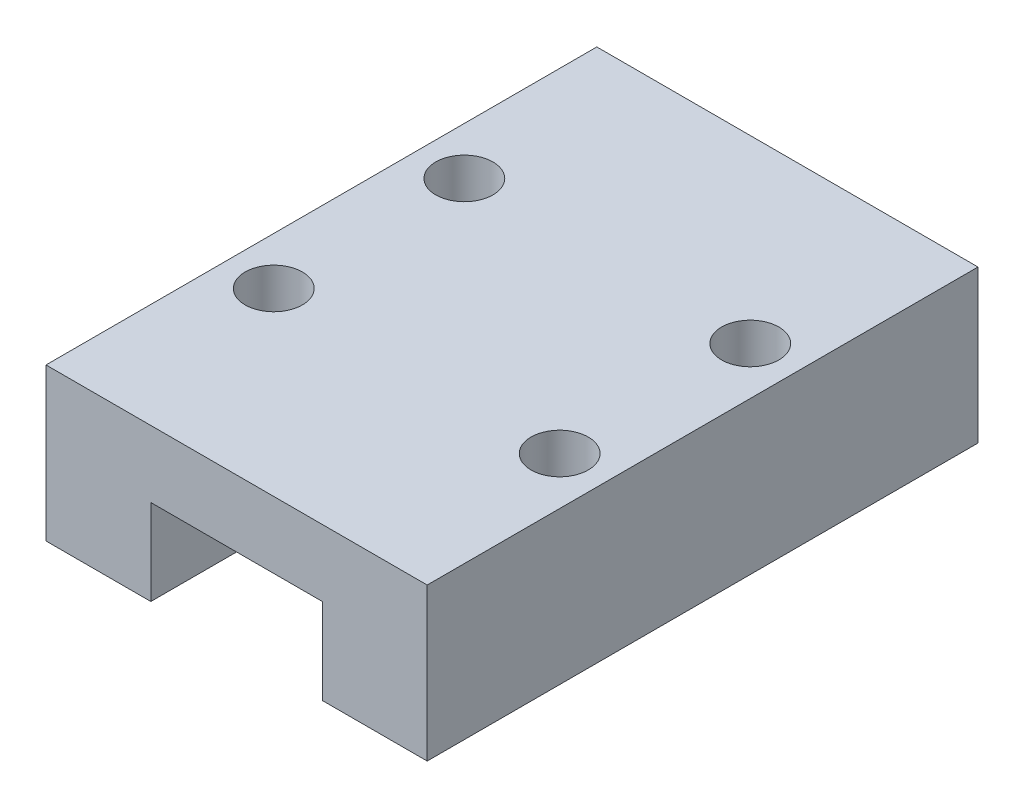
ISO-10303-21;
HEADER;
FILE_DESCRIPTION(('STEP AP214'),'2;1');
FILE_NAME('part.step','',(''),(''),'','','');
FILE_SCHEMA(('AUTOMOTIVE_DESIGN { 1 0 10303 214 1 1 1 1 }'));
ENDSEC;
DATA;
#1=APPLICATION_CONTEXT('core data for automotive mechanical design processes');
#2=APPLICATION_PROTOCOL_DEFINITION('international standard','automotive_design',2000,#1);
#3=PRODUCT_CONTEXT('',#1,'mechanical');
#4=PRODUCT('Part','Part','',(#3));
#5=PRODUCT_RELATED_PRODUCT_CATEGORY('part','',(#4));
#6=PRODUCT_DEFINITION_FORMATION('','',#4);
#7=PRODUCT_DEFINITION_CONTEXT('part definition',#1,'design');
#8=PRODUCT_DEFINITION('design','',#6,#7);
#9=PRODUCT_DEFINITION_SHAPE('','',#8);
#10=(LENGTH_UNIT() NAMED_UNIT(*) SI_UNIT(.MILLI.,.METRE.));
#11=(NAMED_UNIT(*) PLANE_ANGLE_UNIT() SI_UNIT($,.RADIAN.));
#12=(NAMED_UNIT(*) SI_UNIT($,.STERADIAN.) SOLID_ANGLE_UNIT());
#13=UNCERTAINTY_MEASURE_WITH_UNIT(LENGTH_MEASURE(1.E-05),#10,'distance_accuracy_value','');
#14=(GEOMETRIC_REPRESENTATION_CONTEXT(3) GLOBAL_UNCERTAINTY_ASSIGNED_CONTEXT((#13)) GLOBAL_UNIT_ASSIGNED_CONTEXT((#10,
#11,#12)) REPRESENTATION_CONTEXT('',''));
#15=CARTESIAN_POINT('',(0.,0.,0.));
#16=DIRECTION('',(0.,0.,1.));
#17=DIRECTION('',(1.,0.,0.));
#18=AXIS2_PLACEMENT_3D('',#15,#16,#17);
#19=CARTESIAN_POINT('',(0.,0.500000000000002,28.9));
#20=DIRECTION('',(0.,1.,0.));
#21=DIRECTION('',(0.,0.,1.));
#22=AXIS2_PLACEMENT_3D('',#19,#20,#21);
#23=PLANE('',#22);
#24=DIRECTION('',(1.,0.,0.));
#25=VECTOR('',#24,1.);
#26=CARTESIAN_POINT('',(0.,0.500000000000002,0.));
#27=LINE('',#26,#25);
#28=CARTESIAN_POINT('',(-4.5,0.500000000000002,0.));
#29=VERTEX_POINT('',#28);
#30=CARTESIAN_POINT('',(4.5,0.500000000000002,0.));
#31=VERTEX_POINT('',#30);
#32=EDGE_CURVE('E153',#29,#31,#27,.T.);
#33=ORIENTED_EDGE('',*,*,#32,.T.);
#34=DIRECTION('',(0.,0.,-1.));
#35=VECTOR('',#34,1.);
#36=CARTESIAN_POINT('',(4.5,0.500000000000002,28.9));
#37=LINE('',#36,#35);
#38=CARTESIAN_POINT('',(4.5,0.500000000000002,28.9));
#39=VERTEX_POINT('',#38);
#40=EDGE_CURVE('E11',#39,#31,#37,.T.);
#41=ORIENTED_EDGE('',*,*,#40,.F.);
#42=DIRECTION('',(1.,0.,0.));
#43=VECTOR('',#42,1.);
#44=CARTESIAN_POINT('',(0.,0.500000000000002,28.9));
#45=LINE('',#44,#43);
#46=CARTESIAN_POINT('',(-4.5,0.500000000000002,28.9));
#47=VERTEX_POINT('',#46);
#48=EDGE_CURVE('E142',#47,#39,#45,.T.);
#49=ORIENTED_EDGE('',*,*,#48,.F.);
#50=DIRECTION('',(0.,0.,-1.));
#51=VECTOR('',#50,1.);
#52=CARTESIAN_POINT('',(-4.5,0.500000000000002,28.9));
#53=LINE('',#52,#51);
#54=EDGE_CURVE('E57',#47,#29,#53,.T.);
#55=ORIENTED_EDGE('',*,*,#54,.T.);
#56=EDGE_LOOP('',(#33,#41,#49,#55));
#57=FACE_BOUND('',#56,.T.);
#58=ADVANCED_FACE('F41',(#57),#23,.F.);
#59=CARTESIAN_POINT('',(4.5,0.,28.9));
#60=DIRECTION('',(1.,0.,0.));
#61=DIRECTION('',(0.,1.,0.));
#62=AXIS2_PLACEMENT_3D('',#59,#60,#61);
#63=PLANE('',#62);
#64=DIRECTION('',(0.,-1.,0.));
#65=VECTOR('',#64,1.);
#66=CARTESIAN_POINT('',(4.5,0.,0.));
#67=LINE('',#66,#65);
#68=CARTESIAN_POINT('',(4.5,-4.,0.));
#69=VERTEX_POINT('',#68);
#70=EDGE_CURVE('E210',#31,#69,#67,.T.);
#71=ORIENTED_EDGE('',*,*,#70,.T.);
#72=DIRECTION('',(0.,0.,-1.));
#73=VECTOR('',#72,1.);
#74=CARTESIAN_POINT('',(4.5,-4.,28.9));
#75=LINE('',#74,#73);
#76=CARTESIAN_POINT('',(4.5,-4.,28.9));
#77=VERTEX_POINT('',#76);
#78=EDGE_CURVE('E49',#77,#69,#75,.T.);
#79=ORIENTED_EDGE('',*,*,#78,.F.);
#80=DIRECTION('',(0.,-1.,0.));
#81=VECTOR('',#80,1.);
#82=CARTESIAN_POINT('',(4.5,0.,28.9));
#83=LINE('',#82,#81);
#84=EDGE_CURVE('E95',#39,#77,#83,.T.);
#85=ORIENTED_EDGE('',*,*,#84,.F.);
#86=ORIENTED_EDGE('',*,*,#40,.T.);
#87=EDGE_LOOP('',(#71,#79,#85,#86));
#88=FACE_BOUND('',#87,.T.);
#89=ADVANCED_FACE('F211',(#88),#63,.F.);
#90=CARTESIAN_POINT('',(0.,-4.,28.9));
#91=DIRECTION('',(0.,-1.,0.));
#92=DIRECTION('',(1.,0.,0.));
#93=AXIS2_PLACEMENT_3D('',#90,#91,#92);
#94=PLANE('',#93);
#95=DIRECTION('',(-1.,0.,0.));
#96=VECTOR('',#95,1.);
#97=CARTESIAN_POINT('',(0.,-4.,0.));
#98=LINE('',#97,#96);
#99=CARTESIAN_POINT('',(10.,-4.,0.));
#100=VERTEX_POINT('',#99);
#101=EDGE_CURVE('E197',#100,#69,#98,.T.);
#102=ORIENTED_EDGE('',*,*,#101,.F.);
#103=DIRECTION('',(0.,0.,-1.));
#104=VECTOR('',#103,1.);
#105=CARTESIAN_POINT('',(10.,-4.,28.9));
#106=LINE('',#105,#104);
#107=CARTESIAN_POINT('',(10.,-4.,28.9));
#108=VERTEX_POINT('',#107);
#109=EDGE_CURVE('E205',#108,#100,#106,.T.);
#110=ORIENTED_EDGE('',*,*,#109,.F.);
#111=DIRECTION('',(-1.,0.,0.));
#112=VECTOR('',#111,1.);
#113=CARTESIAN_POINT('',(0.,-4.,28.9));
#114=LINE('',#113,#112);
#115=EDGE_CURVE('E134',#108,#77,#114,.T.);
#116=ORIENTED_EDGE('',*,*,#115,.T.);
#117=ORIENTED_EDGE('',*,*,#78,.T.);
#118=EDGE_LOOP('',(#102,#110,#116,#117));
#119=FACE_BOUND('',#118,.T.);
#120=ADVANCED_FACE('F208',(#119),#94,.T.);
#121=CARTESIAN_POINT('',(10.,0.,28.9));
#122=DIRECTION('',(-1.,0.,0.));
#123=DIRECTION('',(0.,0.,1.));
#124=AXIS2_PLACEMENT_3D('',#121,#122,#123);
#125=PLANE('',#124);
#126=DIRECTION('',(0.,1.,0.));
#127=VECTOR('',#126,1.);
#128=CARTESIAN_POINT('',(10.,0.,0.));
#129=LINE('',#128,#127);
#130=CARTESIAN_POINT('',(10.,4.,0.));
#131=VERTEX_POINT('',#130);
#132=EDGE_CURVE('E190',#100,#131,#129,.T.);
#133=ORIENTED_EDGE('',*,*,#132,.T.);
#134=DIRECTION('',(0.,0.,-1.));
#135=VECTOR('',#134,1.);
#136=CARTESIAN_POINT('',(10.,4.,28.9));
#137=LINE('',#136,#135);
#138=CARTESIAN_POINT('',(10.,4.,28.9));
#139=VERTEX_POINT('',#138);
#140=EDGE_CURVE('E187',#139,#131,#137,.T.);
#141=ORIENTED_EDGE('',*,*,#140,.F.);
#142=DIRECTION('',(0.,1.,0.));
#143=VECTOR('',#142,1.);
#144=CARTESIAN_POINT('',(10.,0.,28.9));
#145=LINE('',#144,#143);
#146=EDGE_CURVE('E139',#108,#139,#145,.T.);
#147=ORIENTED_EDGE('',*,*,#146,.F.);
#148=ORIENTED_EDGE('',*,*,#109,.T.);
#149=EDGE_LOOP('',(#133,#141,#147,#148));
#150=FACE_BOUND('',#149,.T.);
#151=ADVANCED_FACE('F177',(#150),#125,.F.);
#152=CARTESIAN_POINT('',(0.,4.,28.9));
#153=DIRECTION('',(0.,-1.,0.));
#154=DIRECTION('',(1.,0.,0.));
#155=AXIS2_PLACEMENT_3D('',#152,#153,#154);
#156=PLANE('',#155);
#157=CARTESIAN_POINT('',(-7.5,4.,19.45));
#158=DIRECTION('',(0.,1.,0.));
#159=DIRECTION('',(-1.,0.,0.));
#160=AXIS2_PLACEMENT_3D('',#157,#158,#159);
#161=CIRCLE('',#160,1.5);
#162=CARTESIAN_POINT('',(-9.,4.,19.45));
#163=VERTEX_POINT('',#162);
#164=EDGE_CURVE('E157',#163,#163,#161,.T.);
#165=ORIENTED_EDGE('',*,*,#164,.F.);
#166=EDGE_LOOP('',(#165));
#167=FACE_BOUND('',#166,.T.);
#168=CARTESIAN_POINT('',(7.5,4.,9.45));
#169=DIRECTION('',(0.,1.,0.));
#170=DIRECTION('',(-1.,0.,0.));
#171=AXIS2_PLACEMENT_3D('',#168,#169,#170);
#172=CIRCLE('',#171,1.5);
#173=CARTESIAN_POINT('',(6.,4.,9.45));
#174=VERTEX_POINT('',#173);
#175=EDGE_CURVE('E163',#174,#174,#172,.T.);
#176=ORIENTED_EDGE('',*,*,#175,.F.);
#177=EDGE_LOOP('',(#176));
#178=FACE_BOUND('',#177,.T.);
#179=CARTESIAN_POINT('',(7.5,4.,19.45));
#180=DIRECTION('',(0.,1.,0.));
#181=DIRECTION('',(-1.,0.,0.));
#182=AXIS2_PLACEMENT_3D('',#179,#180,#181);
#183=CIRCLE('',#182,1.5);
#184=CARTESIAN_POINT('',(6.,4.,19.45));
#185=VERTEX_POINT('',#184);
#186=EDGE_CURVE('E150',#185,#185,#183,.T.);
#187=ORIENTED_EDGE('',*,*,#186,.F.);
#188=EDGE_LOOP('',(#187));
#189=FACE_BOUND('',#188,.T.);
#190=CARTESIAN_POINT('',(-7.5,4.,9.45));
#191=DIRECTION('',(0.,1.,0.));
#192=DIRECTION('',(-1.,0.,0.));
#193=AXIS2_PLACEMENT_3D('',#190,#191,#192);
#194=CIRCLE('',#193,1.5);
#195=CARTESIAN_POINT('',(-9.,4.,9.45));
#196=VERTEX_POINT('',#195);
#197=EDGE_CURVE('E146',#196,#196,#194,.T.);
#198=ORIENTED_EDGE('',*,*,#197,.F.);
#199=EDGE_LOOP('',(#198));
#200=FACE_BOUND('',#199,.T.);
#201=DIRECTION('',(-1.,0.,0.));
#202=VECTOR('',#201,1.);
#203=CARTESIAN_POINT('',(0.,4.,0.));
#204=LINE('',#203,#202);
#205=CARTESIAN_POINT('',(-9.99999999999999,4.,0.));
#206=VERTEX_POINT('',#205);
#207=EDGE_CURVE('E185',#131,#206,#204,.T.);
#208=ORIENTED_EDGE('',*,*,#207,.T.);
#209=DIRECTION('',(0.,0.,-1.));
#210=VECTOR('',#209,1.);
#211=CARTESIAN_POINT('',(-9.99999999999999,4.,28.9));
#212=LINE('',#211,#210);
#213=CARTESIAN_POINT('',(-9.99999999999999,4.,28.9));
#214=VERTEX_POINT('',#213);
#215=EDGE_CURVE('E120',#214,#206,#212,.T.);
#216=ORIENTED_EDGE('',*,*,#215,.F.);
#217=DIRECTION('',(-1.,0.,0.));
#218=VECTOR('',#217,1.);
#219=CARTESIAN_POINT('',(0.,4.,28.9));
#220=LINE('',#219,#218);
#221=EDGE_CURVE('E128',#139,#214,#220,.T.);
#222=ORIENTED_EDGE('',*,*,#221,.F.);
#223=ORIENTED_EDGE('',*,*,#140,.T.);
#224=EDGE_LOOP('',(#208,#216,#222,#223));
#225=FACE_BOUND('',#224,.T.);
#226=ADVANCED_FACE('F174',(#167,#178,#189,#200,#225),#156,.F.);
#227=CARTESIAN_POINT('',(-9.99999999999999,0.,28.9));
#228=DIRECTION('',(-1.,0.,0.));
#229=DIRECTION('',(0.,-1.,0.));
#230=AXIS2_PLACEMENT_3D('',#227,#228,#229);
#231=PLANE('',#230);
#232=DIRECTION('',(0.,1.,0.));
#233=VECTOR('',#232,1.);
#234=CARTESIAN_POINT('',(-9.99999999999999,0.,0.));
#235=LINE('',#234,#233);
#236=CARTESIAN_POINT('',(-9.99999999999999,-4.,0.));
#237=VERTEX_POINT('',#236);
#238=EDGE_CURVE('E116',#237,#206,#235,.T.);
#239=ORIENTED_EDGE('',*,*,#238,.F.);
#240=DIRECTION('',(0.,0.,-1.));
#241=VECTOR('',#240,1.);
#242=CARTESIAN_POINT('',(-9.99999999999999,-4.,28.9));
#243=LINE('',#242,#241);
#244=CARTESIAN_POINT('',(-9.99999999999999,-4.,28.9));
#245=VERTEX_POINT('',#244);
#246=EDGE_CURVE('E111',#245,#237,#243,.T.);
#247=ORIENTED_EDGE('',*,*,#246,.F.);
#248=DIRECTION('',(0.,1.,0.));
#249=VECTOR('',#248,1.);
#250=CARTESIAN_POINT('',(-9.99999999999999,0.,28.9));
#251=LINE('',#250,#249);
#252=EDGE_CURVE('E114',#245,#214,#251,.T.);
#253=ORIENTED_EDGE('',*,*,#252,.T.);
#254=ORIENTED_EDGE('',*,*,#215,.T.);
#255=EDGE_LOOP('',(#239,#247,#253,#254));
#256=FACE_BOUND('',#255,.T.);
#257=ADVANCED_FACE('F113',(#256),#231,.T.);
#258=CARTESIAN_POINT('',(-4.5,-4.,0.));
#259=VERTEX_POINT('',#258);
#260=EDGE_CURVE('E194',#259,#237,#98,.T.);
#261=ORIENTED_EDGE('',*,*,#260,.F.);
#262=DIRECTION('',(0.,0.,-1.));
#263=VECTOR('',#262,1.);
#264=CARTESIAN_POINT('',(-4.5,-4.,28.9));
#265=LINE('',#264,#263);
#266=CARTESIAN_POINT('',(-4.5,-4.,28.9));
#267=VERTEX_POINT('',#266);
#268=EDGE_CURVE('E83',#267,#259,#265,.T.);
#269=ORIENTED_EDGE('',*,*,#268,.F.);
#270=EDGE_CURVE('E126',#267,#245,#114,.T.);
#271=ORIENTED_EDGE('',*,*,#270,.T.);
#272=ORIENTED_EDGE('',*,*,#246,.T.);
#273=EDGE_LOOP('',(#261,#269,#271,#272));
#274=FACE_BOUND('',#273,.T.);
#275=ADVANCED_FACE('F131',(#274),#94,.T.);
#276=CARTESIAN_POINT('',(-4.5,0.,28.9));
#277=DIRECTION('',(1.,0.,0.));
#278=DIRECTION('',(0.,1.,0.));
#279=AXIS2_PLACEMENT_3D('',#276,#277,#278);
#280=PLANE('',#279);
#281=DIRECTION('',(0.,-1.,0.));
#282=VECTOR('',#281,1.);
#283=CARTESIAN_POINT('',(-4.5,0.,0.));
#284=LINE('',#283,#282);
#285=EDGE_CURVE('E143',#29,#259,#284,.T.);
#286=ORIENTED_EDGE('',*,*,#285,.F.);
#287=ORIENTED_EDGE('',*,*,#54,.F.);
#288=DIRECTION('',(0.,-1.,0.));
#289=VECTOR('',#288,1.);
#290=CARTESIAN_POINT('',(-4.5,0.,28.9));
#291=LINE('',#290,#289);
#292=EDGE_CURVE('E132',#47,#267,#291,.T.);
#293=ORIENTED_EDGE('',*,*,#292,.T.);
#294=ORIENTED_EDGE('',*,*,#268,.T.);
#295=EDGE_LOOP('',(#286,#287,#293,#294));
#296=FACE_BOUND('',#295,.T.);
#297=ADVANCED_FACE('F216',(#296),#280,.T.);
#298=CARTESIAN_POINT('',(0.,0.,28.9));
#299=DIRECTION('',(0.,0.,1.));
#300=DIRECTION('',(1.,0.,0.));
#301=AXIS2_PLACEMENT_3D('',#298,#299,#300);
#302=PLANE('',#301);
#303=ORIENTED_EDGE('',*,*,#48,.T.);
#304=ORIENTED_EDGE('',*,*,#84,.T.);
#305=ORIENTED_EDGE('',*,*,#115,.F.);
#306=ORIENTED_EDGE('',*,*,#146,.T.);
#307=ORIENTED_EDGE('',*,*,#221,.T.);
#308=ORIENTED_EDGE('',*,*,#252,.F.);
#309=ORIENTED_EDGE('',*,*,#270,.F.);
#310=ORIENTED_EDGE('',*,*,#292,.F.);
#311=EDGE_LOOP('',(#303,#304,#305,#306,#307,#308,#309,#310));
#312=FACE_BOUND('',#311,.T.);
#313=ADVANCED_FACE('F124',(#312),#302,.T.);
#314=CARTESIAN_POINT('',(0.,0.,0.));
#315=DIRECTION('',(0.,0.,1.));
#316=DIRECTION('',(1.,0.,0.));
#317=AXIS2_PLACEMENT_3D('',#314,#315,#316);
#318=PLANE('',#317);
#319=ORIENTED_EDGE('',*,*,#32,.F.);
#320=ORIENTED_EDGE('',*,*,#285,.T.);
#321=ORIENTED_EDGE('',*,*,#260,.T.);
#322=ORIENTED_EDGE('',*,*,#238,.T.);
#323=ORIENTED_EDGE('',*,*,#207,.F.);
#324=ORIENTED_EDGE('',*,*,#132,.F.);
#325=ORIENTED_EDGE('',*,*,#101,.T.);
#326=ORIENTED_EDGE('',*,*,#70,.F.);
#327=EDGE_LOOP('',(#319,#320,#321,#322,#323,#324,#325,#326));
#328=FACE_BOUND('',#327,.T.);
#329=ADVANCED_FACE('F192',(#328),#318,.F.);
#330=CARTESIAN_POINT('',(-7.5,0.999999999999999,9.45));
#331=DIRECTION('',(0.,1.,0.));
#332=DIRECTION('',(-1.,0.,0.));
#333=AXIS2_PLACEMENT_3D('',#330,#331,#332);
#334=CYLINDRICAL_SURFACE('',#333,1.5);
#335=CARTESIAN_POINT('',(-7.5,0.999999999999999,9.45));
#336=DIRECTION('',(0.,1.,0.));
#337=DIRECTION('',(-1.,0.,0.));
#338=AXIS2_PLACEMENT_3D('',#335,#336,#337);
#339=CIRCLE('',#338,1.5);
#340=CARTESIAN_POINT('',(-9.,0.999999999999999,9.45));
#341=VERTEX_POINT('',#340);
#342=EDGE_CURVE('E149',#341,#341,#339,.T.);
#343=ORIENTED_EDGE('',*,*,#342,.F.);
#344=EDGE_LOOP('',(#343));
#345=FACE_BOUND('',#344,.T.);
#346=ORIENTED_EDGE('',*,*,#197,.T.);
#347=EDGE_LOOP('',(#346));
#348=FACE_BOUND('',#347,.T.);
#349=ADVANCED_FACE('F268',(#345,#348),#334,.F.);
#350=CARTESIAN_POINT('',(-7.5,0.999999999999999,9.45));
#351=DIRECTION('',(0.,1.,0.));
#352=DIRECTION('',(-1.,0.,0.));
#353=AXIS2_PLACEMENT_3D('',#350,#351,#352);
#354=PLANE('',#353);
#355=ORIENTED_EDGE('',*,*,#342,.T.);
#356=EDGE_LOOP('',(#355));
#357=FACE_BOUND('',#356,.T.);
#358=ADVANCED_FACE('F276',(#357),#354,.T.);
#359=CARTESIAN_POINT('',(7.5,1.,19.45));
#360=DIRECTION('',(0.,1.,0.));
#361=DIRECTION('',(-1.,0.,0.));
#362=AXIS2_PLACEMENT_3D('',#359,#360,#361);
#363=CYLINDRICAL_SURFACE('',#362,1.5);
#364=CARTESIAN_POINT('',(7.5,1.,19.45));
#365=DIRECTION('',(0.,1.,0.));
#366=DIRECTION('',(-1.,0.,0.));
#367=AXIS2_PLACEMENT_3D('',#364,#365,#366);
#368=CIRCLE('',#367,1.5);
#369=CARTESIAN_POINT('',(6.,1.,19.45));
#370=VERTEX_POINT('',#369);
#371=EDGE_CURVE('E166',#370,#370,#368,.T.);
#372=ORIENTED_EDGE('',*,*,#371,.F.);
#373=EDGE_LOOP('',(#372));
#374=FACE_BOUND('',#373,.T.);
#375=ORIENTED_EDGE('',*,*,#186,.T.);
#376=EDGE_LOOP('',(#375));
#377=FACE_BOUND('',#376,.T.);
#378=ADVANCED_FACE('F172',(#374,#377),#363,.F.);
#379=CARTESIAN_POINT('',(7.5,1.,19.45));
#380=DIRECTION('',(0.,1.,0.));
#381=DIRECTION('',(-1.,0.,0.));
#382=AXIS2_PLACEMENT_3D('',#379,#380,#381);
#383=PLANE('',#382);
#384=ORIENTED_EDGE('',*,*,#371,.T.);
#385=EDGE_LOOP('',(#384));
#386=FACE_BOUND('',#385,.T.);
#387=ADVANCED_FACE('F295',(#386),#383,.T.);
#388=CARTESIAN_POINT('',(7.5,1.,9.45));
#389=DIRECTION('',(0.,1.,0.));
#390=DIRECTION('',(-1.,0.,0.));
#391=AXIS2_PLACEMENT_3D('',#388,#389,#390);
#392=CYLINDRICAL_SURFACE('',#391,1.5);
#393=CARTESIAN_POINT('',(7.5,1.,9.45));
#394=DIRECTION('',(0.,1.,0.));
#395=DIRECTION('',(-1.,0.,0.));
#396=AXIS2_PLACEMENT_3D('',#393,#394,#395);
#397=CIRCLE('',#396,1.5);
#398=CARTESIAN_POINT('',(6.,1.,9.45));
#399=VERTEX_POINT('',#398);
#400=EDGE_CURVE('E160',#399,#399,#397,.T.);
#401=ORIENTED_EDGE('',*,*,#400,.F.);
#402=EDGE_LOOP('',(#401));
#403=FACE_BOUND('',#402,.T.);
#404=ORIENTED_EDGE('',*,*,#175,.T.);
#405=EDGE_LOOP('',(#404));
#406=FACE_BOUND('',#405,.T.);
#407=ADVANCED_FACE('F305',(#403,#406),#392,.F.);
#408=CARTESIAN_POINT('',(7.5,1.,9.45));
#409=DIRECTION('',(0.,1.,0.));
#410=DIRECTION('',(-1.,0.,0.));
#411=AXIS2_PLACEMENT_3D('',#408,#409,#410);
#412=PLANE('',#411);
#413=ORIENTED_EDGE('',*,*,#400,.T.);
#414=EDGE_LOOP('',(#413));
#415=FACE_BOUND('',#414,.T.);
#416=ADVANCED_FACE('F315',(#415),#412,.T.);
#417=CARTESIAN_POINT('',(-7.5,0.999999999999999,19.45));
#418=DIRECTION('',(0.,1.,0.));
#419=DIRECTION('',(-1.,0.,0.));
#420=AXIS2_PLACEMENT_3D('',#417,#418,#419);
#421=CYLINDRICAL_SURFACE('',#420,1.5);
#422=CARTESIAN_POINT('',(-7.5,0.999999999999999,19.45));
#423=DIRECTION('',(0.,1.,0.));
#424=DIRECTION('',(-1.,0.,0.));
#425=AXIS2_PLACEMENT_3D('',#422,#423,#424);
#426=CIRCLE('',#425,1.5);
#427=CARTESIAN_POINT('',(-9.,0.999999999999999,19.45));
#428=VERTEX_POINT('',#427);
#429=EDGE_CURVE('E154',#428,#428,#426,.T.);
#430=ORIENTED_EDGE('',*,*,#429,.F.);
#431=EDGE_LOOP('',(#430));
#432=FACE_BOUND('',#431,.T.);
#433=ORIENTED_EDGE('',*,*,#164,.T.);
#434=EDGE_LOOP('',(#433));
#435=FACE_BOUND('',#434,.T.);
#436=ADVANCED_FACE('F325',(#432,#435),#421,.F.);
#437=CARTESIAN_POINT('',(-7.5,0.999999999999999,19.45));
#438=DIRECTION('',(0.,1.,0.));
#439=DIRECTION('',(-1.,0.,0.));
#440=AXIS2_PLACEMENT_3D('',#437,#438,#439);
#441=PLANE('',#440);
#442=ORIENTED_EDGE('',*,*,#429,.T.);
#443=EDGE_LOOP('',(#442));
#444=FACE_BOUND('',#443,.T.);
#445=ADVANCED_FACE('F335',(#444),#441,.T.);
#446=CLOSED_SHELL('',(#58,#89,#120,#151,#226,#257,#275,#297,#313,#329,#349,#358,#378,#387,#407,
#416,#436,#445));
#447=MANIFOLD_SOLID_BREP('B2',#446);
#448=ADVANCED_BREP_SHAPE_REPRESENTATION('',(#18,#447),#14);
#449=SHAPE_DEFINITION_REPRESENTATION(#9,#448);
ENDSEC;
END-ISO-10303-21;
